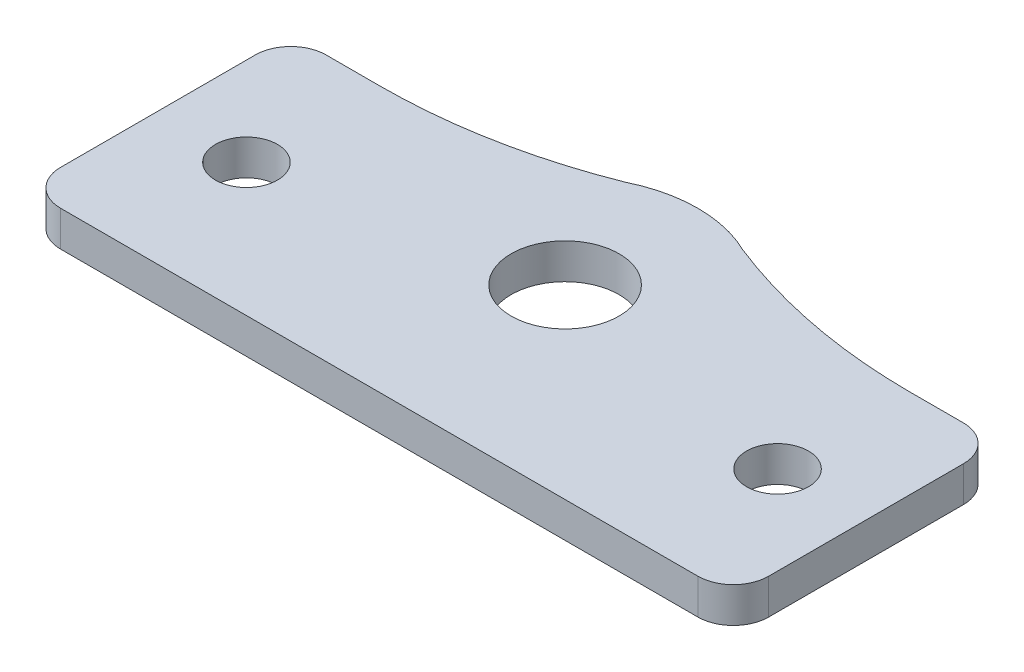
ISO-10303-21;
HEADER;
FILE_DESCRIPTION(('STEP AP214'),'2;1');
FILE_NAME('part.step','',(''),(''),'','','');
FILE_SCHEMA(('AUTOMOTIVE_DESIGN { 1 0 10303 214 1 1 1 1 }'));
ENDSEC;
DATA;
#1=APPLICATION_CONTEXT('core data for automotive mechanical design processes');
#2=APPLICATION_PROTOCOL_DEFINITION('international standard','automotive_design',2000,#1);
#3=PRODUCT_CONTEXT('',#1,'mechanical');
#4=PRODUCT('Part','Part','',(#3));
#5=PRODUCT_RELATED_PRODUCT_CATEGORY('part','',(#4));
#6=PRODUCT_DEFINITION_FORMATION('','',#4);
#7=PRODUCT_DEFINITION_CONTEXT('part definition',#1,'design');
#8=PRODUCT_DEFINITION('design','',#6,#7);
#9=PRODUCT_DEFINITION_SHAPE('','',#8);
#10=(LENGTH_UNIT() NAMED_UNIT(*) SI_UNIT(.MILLI.,.METRE.));
#11=(NAMED_UNIT(*) PLANE_ANGLE_UNIT() SI_UNIT($,.RADIAN.));
#12=(NAMED_UNIT(*) SI_UNIT($,.STERADIAN.) SOLID_ANGLE_UNIT());
#13=UNCERTAINTY_MEASURE_WITH_UNIT(LENGTH_MEASURE(1.E-05),#10,'distance_accuracy_value','');
#14=(GEOMETRIC_REPRESENTATION_CONTEXT(3) GLOBAL_UNCERTAINTY_ASSIGNED_CONTEXT((#13)) GLOBAL_UNIT_ASSIGNED_CONTEXT((#10,
#11,#12)) REPRESENTATION_CONTEXT('',''));
#15=CARTESIAN_POINT('',(0.,0.,0.));
#16=DIRECTION('',(0.,0.,1.));
#17=DIRECTION('',(1.,0.,0.));
#18=AXIS2_PLACEMENT_3D('',#15,#16,#17);
#19=CARTESIAN_POINT('',(30.,2.,-46.740697547539));
#20=DIRECTION('',(0.,-1.,0.));
#21=DIRECTION('',(0.,0.,-1.));
#22=AXIS2_PLACEMENT_3D('',#19,#20,#21);
#23=CYLINDRICAL_SURFACE('',#22,31.7406975475389);
#24=CARTESIAN_POINT('',(30.,0.,-46.740697547539));
#25=DIRECTION('',(0.,1.,0.));
#26=DIRECTION('',(0.,0.,1.));
#27=AXIS2_PLACEMENT_3D('',#24,#25,#26);
#28=CIRCLE('',#27,31.7406975475389);
#29=CARTESIAN_POINT('',(30.0000000000002,0.,-15.0000000000002));
#30=VERTEX_POINT('',#29);
#31=CARTESIAN_POINT('',(18.2990390831886,0.,-17.2354540401962));
#32=VERTEX_POINT('',#31);
#33=EDGE_CURVE('E185',#30,#32,#28,.F.);
#34=ORIENTED_EDGE('',*,*,#33,.T.);
#35=DIRECTION('',(0.,-1.,0.));
#36=VECTOR('',#35,1.);
#37=CARTESIAN_POINT('',(18.2990390831886,2.,-17.2354540401962));
#38=LINE('',#37,#36);
#39=CARTESIAN_POINT('',(18.2990390831886,2.,-17.2354540401962));
#40=VERTEX_POINT('',#39);
#41=EDGE_CURVE('E11',#40,#32,#38,.T.);
#42=ORIENTED_EDGE('',*,*,#41,.F.);
#43=CARTESIAN_POINT('',(30.,2.,-46.740697547539));
#44=DIRECTION('',(0.,1.,0.));
#45=DIRECTION('',(0.,0.,1.));
#46=AXIS2_PLACEMENT_3D('',#43,#44,#45);
#47=CIRCLE('',#46,31.7406975475389);
#48=CARTESIAN_POINT('',(30.0000000000002,2.,-15.0000000000002));
#49=VERTEX_POINT('',#48);
#50=EDGE_CURVE('E279',#49,#40,#47,.F.);
#51=ORIENTED_EDGE('',*,*,#50,.F.);
#52=DIRECTION('',(0.,-1.,0.));
#53=VECTOR('',#52,1.);
#54=CARTESIAN_POINT('',(30.0000000000002,2.,-15.0000000000002));
#55=LINE('',#54,#53);
#56=EDGE_CURVE('E172',#49,#30,#55,.T.);
#57=ORIENTED_EDGE('',*,*,#56,.T.);
#58=EDGE_LOOP('',(#34,#42,#51,#57));
#59=FACE_BOUND('',#58,.T.);
#60=ADVANCED_FACE('F45',(#59),#23,.F.);
#61=CARTESIAN_POINT('',(15.0000000000001,2.,-10.5000000000001));
#62=DIRECTION('',(0.,-1.,0.));
#63=DIRECTION('',(0.,0.,-1.));
#64=AXIS2_PLACEMENT_3D('',#61,#62,#63);
#65=CYLINDRICAL_SURFACE('',#64,7.49999999999986);
#66=CARTESIAN_POINT('',(15.0000000000001,0.,-10.5000000000001));
#67=DIRECTION('',(0.,1.,0.));
#68=DIRECTION('',(0.,0.,1.));
#69=AXIS2_PLACEMENT_3D('',#66,#67,#68);
#70=CIRCLE('',#69,7.49999999999986);
#71=CARTESIAN_POINT('',(11.7009609168114,0.,-17.2354540401961));
#72=VERTEX_POINT('',#71);
#73=EDGE_CURVE('E189',#32,#72,#70,.T.);
#74=ORIENTED_EDGE('',*,*,#73,.T.);
#75=DIRECTION('',(0.,-1.,0.));
#76=VECTOR('',#75,1.);
#77=CARTESIAN_POINT('',(11.7009609168114,2.,-17.2354540401961));
#78=LINE('',#77,#76);
#79=CARTESIAN_POINT('',(11.7009609168114,2.,-17.2354540401961));
#80=VERTEX_POINT('',#79);
#81=EDGE_CURVE('E55',#80,#72,#78,.T.);
#82=ORIENTED_EDGE('',*,*,#81,.F.);
#83=CARTESIAN_POINT('',(15.0000000000001,2.,-10.5000000000001));
#84=DIRECTION('',(0.,1.,0.));
#85=DIRECTION('',(0.,0.,1.));
#86=AXIS2_PLACEMENT_3D('',#83,#84,#85);
#87=CIRCLE('',#86,7.49999999999986);
#88=EDGE_CURVE('E117',#40,#80,#87,.T.);
#89=ORIENTED_EDGE('',*,*,#88,.F.);
#90=ORIENTED_EDGE('',*,*,#41,.T.);
#91=EDGE_LOOP('',(#74,#82,#89,#90));
#92=FACE_BOUND('',#91,.T.);
#93=ADVANCED_FACE('F258',(#92),#65,.T.);
#94=CARTESIAN_POINT('',(0.,2.,-46.740697547539));
#95=DIRECTION('',(0.,-1.,0.));
#96=DIRECTION('',(0.,0.,-1.));
#97=AXIS2_PLACEMENT_3D('',#94,#95,#96);
#98=CYLINDRICAL_SURFACE('',#97,31.740697547539);
#99=CARTESIAN_POINT('',(0.,0.,-46.740697547539));
#100=DIRECTION('',(0.,1.,0.));
#101=DIRECTION('',(0.,0.,1.));
#102=AXIS2_PLACEMENT_3D('',#99,#100,#101);
#103=CIRCLE('',#102,31.740697547539);
#104=CARTESIAN_POINT('',(0.,0.,-15.));
#105=VERTEX_POINT('',#104);
#106=EDGE_CURVE('E193',#105,#72,#103,.T.);
#107=ORIENTED_EDGE('',*,*,#106,.F.);
#108=DIRECTION('',(0.,-1.,0.));
#109=VECTOR('',#108,1.);
#110=CARTESIAN_POINT('',(0.,2.,-15.));
#111=LINE('',#110,#109);
#112=CARTESIAN_POINT('',(0.,2.,-15.));
#113=VERTEX_POINT('',#112);
#114=EDGE_CURVE('E249',#113,#105,#111,.T.);
#115=ORIENTED_EDGE('',*,*,#114,.F.);
#116=CARTESIAN_POINT('',(0.,2.,-46.740697547539));
#117=DIRECTION('',(0.,1.,0.));
#118=DIRECTION('',(0.,0.,1.));
#119=AXIS2_PLACEMENT_3D('',#116,#117,#118);
#120=CIRCLE('',#119,31.740697547539);
#121=EDGE_CURVE('E257',#113,#80,#120,.T.);
#122=ORIENTED_EDGE('',*,*,#121,.T.);
#123=ORIENTED_EDGE('',*,*,#81,.T.);
#124=EDGE_LOOP('',(#107,#115,#122,#123));
#125=FACE_BOUND('',#124,.T.);
#126=ADVANCED_FACE('F255',(#125),#98,.F.);
#127=CARTESIAN_POINT('',(0.,2.,-15.));
#128=DIRECTION('',(0.,0.,1.));
#129=DIRECTION('',(1.,0.,0.));
#130=AXIS2_PLACEMENT_3D('',#127,#128,#129);
#131=PLANE('',#130);
#132=DIRECTION('',(-1.,0.,0.));
#133=VECTOR('',#132,1.);
#134=CARTESIAN_POINT('',(0.,0.,-15.));
#135=LINE('',#134,#133);
#136=CARTESIAN_POINT('',(-3.,0.,-15.));
#137=VERTEX_POINT('',#136);
#138=EDGE_CURVE('E197',#105,#137,#135,.T.);
#139=ORIENTED_EDGE('',*,*,#138,.T.);
#140=DIRECTION('',(0.,-1.,0.));
#141=VECTOR('',#140,1.);
#142=CARTESIAN_POINT('',(-3.,2.,-15.));
#143=LINE('',#142,#141);
#144=CARTESIAN_POINT('',(-3.,2.,-15.));
#145=VERTEX_POINT('',#144);
#146=EDGE_CURVE('E246',#145,#137,#143,.T.);
#147=ORIENTED_EDGE('',*,*,#146,.F.);
#148=DIRECTION('',(-1.,0.,0.));
#149=VECTOR('',#148,1.);
#150=CARTESIAN_POINT('',(0.,2.,-15.));
#151=LINE('',#150,#149);
#152=EDGE_CURVE('E271',#113,#145,#151,.T.);
#153=ORIENTED_EDGE('',*,*,#152,.F.);
#154=ORIENTED_EDGE('',*,*,#114,.T.);
#155=EDGE_LOOP('',(#139,#147,#153,#154));
#156=FACE_BOUND('',#155,.T.);
#157=ADVANCED_FACE('F268',(#156),#131,.F.);
#158=CARTESIAN_POINT('',(-3.,2.,-13.));
#159=DIRECTION('',(0.,-1.,0.));
#160=DIRECTION('',(0.,0.,-1.));
#161=AXIS2_PLACEMENT_3D('',#158,#159,#160);
#162=CYLINDRICAL_SURFACE('',#161,2.);
#163=CARTESIAN_POINT('',(-3.,0.,-13.));
#164=DIRECTION('',(0.,1.,0.));
#165=DIRECTION('',(0.,0.,1.));
#166=AXIS2_PLACEMENT_3D('',#163,#164,#165);
#167=CIRCLE('',#166,2.);
#168=CARTESIAN_POINT('',(-5.,0.,-13.));
#169=VERTEX_POINT('',#168);
#170=EDGE_CURVE('E201',#169,#137,#167,.F.);
#171=ORIENTED_EDGE('',*,*,#170,.F.);
#172=DIRECTION('',(0.,-1.,0.));
#173=VECTOR('',#172,1.);
#174=CARTESIAN_POINT('',(-5.,2.,-13.));
#175=LINE('',#174,#173);
#176=CARTESIAN_POINT('',(-5.,2.,-13.));
#177=VERTEX_POINT('',#176);
#178=EDGE_CURVE('E243',#177,#169,#175,.T.);
#179=ORIENTED_EDGE('',*,*,#178,.F.);
#180=CARTESIAN_POINT('',(-3.,2.,-13.));
#181=DIRECTION('',(0.,1.,0.));
#182=DIRECTION('',(0.,0.,1.));
#183=AXIS2_PLACEMENT_3D('',#180,#181,#182);
#184=CIRCLE('',#183,2.);
#185=EDGE_CURVE('E274',#177,#145,#184,.F.);
#186=ORIENTED_EDGE('',*,*,#185,.T.);
#187=ORIENTED_EDGE('',*,*,#146,.T.);
#188=EDGE_LOOP('',(#171,#179,#186,#187));
#189=FACE_BOUND('',#188,.T.);
#190=ADVANCED_FACE('F434',(#189),#162,.T.);
#191=CARTESIAN_POINT('',(-5.,2.,0.));
#192=DIRECTION('',(1.,0.,0.));
#193=DIRECTION('',(0.,0.,-1.));
#194=AXIS2_PLACEMENT_3D('',#191,#192,#193);
#195=PLANE('',#194);
#196=DIRECTION('',(0.,0.,1.));
#197=VECTOR('',#196,1.);
#198=CARTESIAN_POINT('',(-5.,0.,0.));
#199=LINE('',#198,#197);
#200=CARTESIAN_POINT('',(-5.,0.,-2.));
#201=VERTEX_POINT('',#200);
#202=EDGE_CURVE('E205',#169,#201,#199,.T.);
#203=ORIENTED_EDGE('',*,*,#202,.T.);
#204=DIRECTION('',(0.,-1.,0.));
#205=VECTOR('',#204,1.);
#206=CARTESIAN_POINT('',(-5.,2.,-2.));
#207=LINE('',#206,#205);
#208=CARTESIAN_POINT('',(-5.,2.,-2.));
#209=VERTEX_POINT('',#208);
#210=EDGE_CURVE('E240',#209,#201,#207,.T.);
#211=ORIENTED_EDGE('',*,*,#210,.F.);
#212=DIRECTION('',(0.,0.,1.));
#213=VECTOR('',#212,1.);
#214=CARTESIAN_POINT('',(-5.,2.,0.));
#215=LINE('',#214,#213);
#216=EDGE_CURVE('E285',#177,#209,#215,.T.);
#217=ORIENTED_EDGE('',*,*,#216,.F.);
#218=ORIENTED_EDGE('',*,*,#178,.T.);
#219=EDGE_LOOP('',(#203,#211,#217,#218));
#220=FACE_BOUND('',#219,.T.);
#221=ADVANCED_FACE('F422',(#220),#195,.F.);
#222=CARTESIAN_POINT('',(-3.,2.,-2.));
#223=DIRECTION('',(0.,-1.,0.));
#224=DIRECTION('',(0.,0.,-1.));
#225=AXIS2_PLACEMENT_3D('',#222,#223,#224);
#226=CYLINDRICAL_SURFACE('',#225,2.);
#227=CARTESIAN_POINT('',(-3.,0.,-2.));
#228=DIRECTION('',(0.,1.,0.));
#229=DIRECTION('',(0.,0.,1.));
#230=AXIS2_PLACEMENT_3D('',#227,#228,#229);
#231=CIRCLE('',#230,2.);
#232=CARTESIAN_POINT('',(-3.,0.,0.));
#233=VERTEX_POINT('',#232);
#234=EDGE_CURVE('E209',#233,#201,#231,.F.);
#235=ORIENTED_EDGE('',*,*,#234,.F.);
#236=DIRECTION('',(0.,-1.,0.));
#237=VECTOR('',#236,1.);
#238=CARTESIAN_POINT('',(-3.,2.,0.));
#239=LINE('',#238,#237);
#240=CARTESIAN_POINT('',(-3.,2.,0.));
#241=VERTEX_POINT('',#240);
#242=EDGE_CURVE('E237',#241,#233,#239,.T.);
#243=ORIENTED_EDGE('',*,*,#242,.F.);
#244=CARTESIAN_POINT('',(-3.,2.,-2.));
#245=DIRECTION('',(0.,1.,0.));
#246=DIRECTION('',(0.,0.,1.));
#247=AXIS2_PLACEMENT_3D('',#244,#245,#246);
#248=CIRCLE('',#247,2.);
#249=EDGE_CURVE('E288',#241,#209,#248,.F.);
#250=ORIENTED_EDGE('',*,*,#249,.T.);
#251=ORIENTED_EDGE('',*,*,#210,.T.);
#252=EDGE_LOOP('',(#235,#243,#250,#251));
#253=FACE_BOUND('',#252,.T.);
#254=ADVANCED_FACE('F412',(#253),#226,.T.);
#255=CARTESIAN_POINT('',(0.,2.,0.));
#256=DIRECTION('',(0.,0.,-1.));
#257=DIRECTION('',(-1.,0.,0.));
#258=AXIS2_PLACEMENT_3D('',#255,#256,#257);
#259=PLANE('',#258);
#260=DIRECTION('',(1.,0.,0.));
#261=VECTOR('',#260,1.);
#262=CARTESIAN_POINT('',(0.,0.,0.));
#263=LINE('',#262,#261);
#264=CARTESIAN_POINT('',(33.0000000000002,0.,0.));
#265=VERTEX_POINT('',#264);
#266=EDGE_CURVE('E213',#233,#265,#263,.T.);
#267=ORIENTED_EDGE('',*,*,#266,.T.);
#268=DIRECTION('',(0.,-1.,0.));
#269=VECTOR('',#268,1.);
#270=CARTESIAN_POINT('',(33.0000000000002,2.,0.));
#271=LINE('',#270,#269);
#272=CARTESIAN_POINT('',(33.0000000000002,2.,0.));
#273=VERTEX_POINT('',#272);
#274=EDGE_CURVE('E233',#273,#265,#271,.T.);
#275=ORIENTED_EDGE('',*,*,#274,.F.);
#276=DIRECTION('',(1.,0.,0.));
#277=VECTOR('',#276,1.);
#278=CARTESIAN_POINT('',(0.,2.,0.));
#279=LINE('',#278,#277);
#280=EDGE_CURVE('E166',#241,#273,#279,.T.);
#281=ORIENTED_EDGE('',*,*,#280,.F.);
#282=ORIENTED_EDGE('',*,*,#242,.T.);
#283=EDGE_LOOP('',(#267,#275,#281,#282));
#284=FACE_BOUND('',#283,.T.);
#285=ADVANCED_FACE('F296',(#284),#259,.F.);
#286=CARTESIAN_POINT('',(33.0000000000002,2.,-2.));
#287=DIRECTION('',(0.,-1.,0.));
#288=DIRECTION('',(0.,0.,-1.));
#289=AXIS2_PLACEMENT_3D('',#286,#287,#288);
#290=CYLINDRICAL_SURFACE('',#289,2.);
#291=CARTESIAN_POINT('',(33.0000000000002,0.,-2.));
#292=DIRECTION('',(0.,1.,0.));
#293=DIRECTION('',(0.,0.,1.));
#294=AXIS2_PLACEMENT_3D('',#291,#292,#293);
#295=CIRCLE('',#294,2.);
#296=CARTESIAN_POINT('',(35.0000000000002,0.,-2.));
#297=VERTEX_POINT('',#296);
#298=EDGE_CURVE('E216',#265,#297,#295,.T.);
#299=ORIENTED_EDGE('',*,*,#298,.T.);
#300=DIRECTION('',(0.,-1.,0.));
#301=VECTOR('',#300,1.);
#302=CARTESIAN_POINT('',(35.0000000000002,2.,-2.));
#303=LINE('',#302,#301);
#304=CARTESIAN_POINT('',(35.0000000000002,2.,-2.));
#305=VERTEX_POINT('',#304);
#306=EDGE_CURVE('E152',#305,#297,#303,.T.);
#307=ORIENTED_EDGE('',*,*,#306,.F.);
#308=CARTESIAN_POINT('',(33.0000000000002,2.,-2.));
#309=DIRECTION('',(0.,1.,0.));
#310=DIRECTION('',(0.,0.,1.));
#311=AXIS2_PLACEMENT_3D('',#308,#309,#310);
#312=CIRCLE('',#311,2.);
#313=EDGE_CURVE('E161',#273,#305,#312,.T.);
#314=ORIENTED_EDGE('',*,*,#313,.F.);
#315=ORIENTED_EDGE('',*,*,#274,.T.);
#316=EDGE_LOOP('',(#299,#307,#314,#315));
#317=FACE_BOUND('',#316,.T.);
#318=ADVANCED_FACE('F300',(#317),#290,.T.);
#319=CARTESIAN_POINT('',(35.0000000000002,2.,0.));
#320=DIRECTION('',(1.,0.,0.));
#321=DIRECTION('',(0.,0.,-1.));
#322=AXIS2_PLACEMENT_3D('',#319,#320,#321);
#323=PLANE('',#322);
#324=DIRECTION('',(0.,0.,1.));
#325=VECTOR('',#324,1.);
#326=CARTESIAN_POINT('',(35.0000000000002,0.,0.));
#327=LINE('',#326,#325);
#328=CARTESIAN_POINT('',(35.0000000000002,0.,-13.));
#329=VERTEX_POINT('',#328);
#330=EDGE_CURVE('E150',#329,#297,#327,.T.);
#331=ORIENTED_EDGE('',*,*,#330,.F.);
#332=DIRECTION('',(0.,-1.,0.));
#333=VECTOR('',#332,1.);
#334=CARTESIAN_POINT('',(35.0000000000002,2.,-13.));
#335=LINE('',#334,#333);
#336=CARTESIAN_POINT('',(35.0000000000002,2.,-13.));
#337=VERTEX_POINT('',#336);
#338=EDGE_CURVE('E144',#337,#329,#335,.T.);
#339=ORIENTED_EDGE('',*,*,#338,.F.);
#340=DIRECTION('',(0.,0.,1.));
#341=VECTOR('',#340,1.);
#342=CARTESIAN_POINT('',(35.0000000000002,2.,0.));
#343=LINE('',#342,#341);
#344=EDGE_CURVE('E148',#337,#305,#343,.T.);
#345=ORIENTED_EDGE('',*,*,#344,.T.);
#346=ORIENTED_EDGE('',*,*,#306,.T.);
#347=EDGE_LOOP('',(#331,#339,#345,#346));
#348=FACE_BOUND('',#347,.T.);
#349=ADVANCED_FACE('F146',(#348),#323,.T.);
#350=CARTESIAN_POINT('',(33.0000000000002,2.,-13.));
#351=DIRECTION('',(0.,-1.,0.));
#352=DIRECTION('',(0.,0.,-1.));
#353=AXIS2_PLACEMENT_3D('',#350,#351,#352);
#354=CYLINDRICAL_SURFACE('',#353,2.);
#355=CARTESIAN_POINT('',(33.0000000000002,0.,-13.));
#356=DIRECTION('',(0.,1.,0.));
#357=DIRECTION('',(0.,0.,1.));
#358=AXIS2_PLACEMENT_3D('',#355,#356,#357);
#359=CIRCLE('',#358,2.);
#360=CARTESIAN_POINT('',(33.0000000000002,0.,-15.));
#361=VERTEX_POINT('',#360);
#362=EDGE_CURVE('E103',#329,#361,#359,.T.);
#363=ORIENTED_EDGE('',*,*,#362,.T.);
#364=DIRECTION('',(0.,-1.,0.));
#365=VECTOR('',#364,1.);
#366=CARTESIAN_POINT('',(33.0000000000002,2.,-15.));
#367=LINE('',#366,#365);
#368=CARTESIAN_POINT('',(33.0000000000002,2.,-15.));
#369=VERTEX_POINT('',#368);
#370=EDGE_CURVE('E153',#369,#361,#367,.T.);
#371=ORIENTED_EDGE('',*,*,#370,.F.);
#372=CARTESIAN_POINT('',(33.0000000000002,2.,-13.));
#373=DIRECTION('',(0.,1.,0.));
#374=DIRECTION('',(0.,0.,1.));
#375=AXIS2_PLACEMENT_3D('',#372,#373,#374);
#376=CIRCLE('',#375,2.);
#377=EDGE_CURVE('E155',#337,#369,#376,.T.);
#378=ORIENTED_EDGE('',*,*,#377,.F.);
#379=ORIENTED_EDGE('',*,*,#338,.T.);
#380=EDGE_LOOP('',(#363,#371,#378,#379));
#381=FACE_BOUND('',#380,.T.);
#382=ADVANCED_FACE('F156',(#381),#354,.T.);
#383=CARTESIAN_POINT('',(15.0000000000001,2.,-10.5000000000001));
#384=DIRECTION('',(0.,-1.,0.));
#385=DIRECTION('',(0.,0.,-1.));
#386=AXIS2_PLACEMENT_3D('',#383,#384,#385);
#387=CYLINDRICAL_SURFACE('',#386,3.05);
#388=CARTESIAN_POINT('',(15.0000000000001,2.,-10.5000000000001));
#389=DIRECTION('',(0.,1.,0.));
#390=DIRECTION('',(0.,0.,1.));
#391=AXIS2_PLACEMENT_3D('',#388,#389,#390);
#392=CIRCLE('',#391,3.05);
#393=CARTESIAN_POINT('',(15.0000000000001,2.,-7.45000000000015));
#394=VERTEX_POINT('',#393);
#395=EDGE_CURVE('E525',#394,#394,#392,.T.);
#396=ORIENTED_EDGE('',*,*,#395,.T.);
#397=EDGE_LOOP('',(#396));
#398=FACE_BOUND('',#397,.T.);
#399=CARTESIAN_POINT('',(15.0000000000001,0.,-10.5000000000001));
#400=DIRECTION('',(0.,1.,0.));
#401=DIRECTION('',(0.,0.,1.));
#402=AXIS2_PLACEMENT_3D('',#399,#400,#401);
#403=CIRCLE('',#402,3.05);
#404=CARTESIAN_POINT('',(15.0000000000001,0.,-7.45000000000015));
#405=VERTEX_POINT('',#404);
#406=EDGE_CURVE('E181',#405,#405,#403,.T.);
#407=ORIENTED_EDGE('',*,*,#406,.F.);
#408=EDGE_LOOP('',(#407));
#409=FACE_BOUND('',#408,.T.);
#410=ADVANCED_FACE('F324',(#398,#409),#387,.F.);
#411=CARTESIAN_POINT('',(30.0000000000002,2.,-7.5));
#412=DIRECTION('',(0.,-1.,0.));
#413=DIRECTION('',(0.,0.,-1.));
#414=AXIS2_PLACEMENT_3D('',#411,#412,#413);
#415=CYLINDRICAL_SURFACE('',#414,1.75);
#416=CARTESIAN_POINT('',(30.0000000000002,2.,-7.5));
#417=DIRECTION('',(0.,1.,0.));
#418=DIRECTION('',(0.,0.,1.));
#419=AXIS2_PLACEMENT_3D('',#416,#417,#418);
#420=CIRCLE('',#419,1.75);
#421=CARTESIAN_POINT('',(30.0000000000002,2.,-5.75));
#422=VERTEX_POINT('',#421);
#423=EDGE_CURVE('E334',#422,#422,#420,.F.);
#424=ORIENTED_EDGE('',*,*,#423,.F.);
#425=EDGE_LOOP('',(#424));
#426=FACE_BOUND('',#425,.T.);
#427=CARTESIAN_POINT('',(30.0000000000002,0.,-7.5));
#428=DIRECTION('',(0.,1.,0.));
#429=DIRECTION('',(0.,0.,1.));
#430=AXIS2_PLACEMENT_3D('',#427,#428,#429);
#431=CIRCLE('',#430,1.75);
#432=CARTESIAN_POINT('',(30.0000000000002,0.,-5.75));
#433=VERTEX_POINT('',#432);
#434=EDGE_CURVE('E177',#433,#433,#431,.F.);
#435=ORIENTED_EDGE('',*,*,#434,.T.);
#436=EDGE_LOOP('',(#435));
#437=FACE_BOUND('',#436,.T.);
#438=ADVANCED_FACE('F312',(#426,#437),#415,.F.);
#439=CARTESIAN_POINT('',(0.,2.,-7.5));
#440=DIRECTION('',(0.,-1.,0.));
#441=DIRECTION('',(0.,0.,-1.));
#442=AXIS2_PLACEMENT_3D('',#439,#440,#441);
#443=CYLINDRICAL_SURFACE('',#442,1.75);
#444=CARTESIAN_POINT('',(0.,2.,-7.5));
#445=DIRECTION('',(0.,1.,0.));
#446=DIRECTION('',(0.,0.,1.));
#447=AXIS2_PLACEMENT_3D('',#444,#445,#446);
#448=CIRCLE('',#447,1.75);
#449=CARTESIAN_POINT('',(0.,2.,-5.75));
#450=VERTEX_POINT('',#449);
#451=EDGE_CURVE('E226',#450,#450,#448,.T.);
#452=ORIENTED_EDGE('',*,*,#451,.T.);
#453=EDGE_LOOP('',(#452));
#454=FACE_BOUND('',#453,.T.);
#455=CARTESIAN_POINT('',(0.,0.,-7.5));
#456=DIRECTION('',(0.,1.,0.));
#457=DIRECTION('',(0.,0.,1.));
#458=AXIS2_PLACEMENT_3D('',#455,#456,#457);
#459=CIRCLE('',#458,1.75);
#460=CARTESIAN_POINT('',(0.,0.,-5.75));
#461=VERTEX_POINT('',#460);
#462=EDGE_CURVE('E173',#461,#461,#459,.T.);
#463=ORIENTED_EDGE('',*,*,#462,.F.);
#464=EDGE_LOOP('',(#463));
#465=FACE_BOUND('',#464,.T.);
#466=ADVANCED_FACE('F47',(#454,#465),#443,.F.);
#467=CARTESIAN_POINT('',(1.20563281580409E-12,2.,-15.0000000000027));
#468=DIRECTION('',(0.,0.,1.));
#469=DIRECTION('',(1.,0.,0.));
#470=AXIS2_PLACEMENT_3D('',#467,#468,#469);
#471=PLANE('',#470);
#472=DIRECTION('',(-1.,0.,0.));
#473=VECTOR('',#472,1.);
#474=CARTESIAN_POINT('',(1.20563281580409E-12,0.,-15.0000000000027));
#475=LINE('',#474,#473);
#476=EDGE_CURVE('E109',#361,#30,#475,.T.);
#477=ORIENTED_EDGE('',*,*,#476,.T.);
#478=ORIENTED_EDGE('',*,*,#56,.F.);
#479=DIRECTION('',(-1.,0.,0.));
#480=VECTOR('',#479,1.);
#481=CARTESIAN_POINT('',(1.20563281580409E-12,2.,-15.0000000000027));
#482=LINE('',#481,#480);
#483=EDGE_CURVE('E63',#369,#49,#482,.T.);
#484=ORIENTED_EDGE('',*,*,#483,.F.);
#485=ORIENTED_EDGE('',*,*,#370,.T.);
#486=EDGE_LOOP('',(#477,#478,#484,#485));
#487=FACE_BOUND('',#486,.T.);
#488=ADVANCED_FACE('F303',(#487),#471,.F.);
#489=CARTESIAN_POINT('',(0.,2.,0.));
#490=DIRECTION('',(0.,1.,0.));
#491=DIRECTION('',(0.,0.,1.));
#492=AXIS2_PLACEMENT_3D('',#489,#490,#491);
#493=PLANE('',#492);
#494=ORIENTED_EDGE('',*,*,#451,.F.);
#495=EDGE_LOOP('',(#494));
#496=FACE_BOUND('',#495,.T.);
#497=ORIENTED_EDGE('',*,*,#423,.T.);
#498=EDGE_LOOP('',(#497));
#499=FACE_BOUND('',#498,.T.);
#500=ORIENTED_EDGE('',*,*,#395,.F.);
#501=EDGE_LOOP('',(#500));
#502=FACE_BOUND('',#501,.T.);
#503=ORIENTED_EDGE('',*,*,#50,.T.);
#504=ORIENTED_EDGE('',*,*,#88,.T.);
#505=ORIENTED_EDGE('',*,*,#121,.F.);
#506=ORIENTED_EDGE('',*,*,#152,.T.);
#507=ORIENTED_EDGE('',*,*,#185,.F.);
#508=ORIENTED_EDGE('',*,*,#216,.T.);
#509=ORIENTED_EDGE('',*,*,#249,.F.);
#510=ORIENTED_EDGE('',*,*,#280,.T.);
#511=ORIENTED_EDGE('',*,*,#313,.T.);
#512=ORIENTED_EDGE('',*,*,#344,.F.);
#513=ORIENTED_EDGE('',*,*,#377,.T.);
#514=ORIENTED_EDGE('',*,*,#483,.T.);
#515=EDGE_LOOP('',(#503,#504,#505,#506,#507,#508,#509,#510,#511,#512,#513,#514));
#516=FACE_BOUND('',#515,.T.);
#517=ADVANCED_FACE('F159',(#496,#499,#502,#516),#493,.T.);
#518=CARTESIAN_POINT('',(0.,0.,0.));
#519=DIRECTION('',(0.,1.,0.));
#520=DIRECTION('',(0.,0.,1.));
#521=AXIS2_PLACEMENT_3D('',#518,#519,#520);
#522=PLANE('',#521);
#523=ORIENTED_EDGE('',*,*,#462,.T.);
#524=EDGE_LOOP('',(#523));
#525=FACE_BOUND('',#524,.T.);
#526=ORIENTED_EDGE('',*,*,#434,.F.);
#527=EDGE_LOOP('',(#526));
#528=FACE_BOUND('',#527,.T.);
#529=ORIENTED_EDGE('',*,*,#406,.T.);
#530=EDGE_LOOP('',(#529));
#531=FACE_BOUND('',#530,.T.);
#532=ORIENTED_EDGE('',*,*,#33,.F.);
#533=ORIENTED_EDGE('',*,*,#476,.F.);
#534=ORIENTED_EDGE('',*,*,#362,.F.);
#535=ORIENTED_EDGE('',*,*,#330,.T.);
#536=ORIENTED_EDGE('',*,*,#298,.F.);
#537=ORIENTED_EDGE('',*,*,#266,.F.);
#538=ORIENTED_EDGE('',*,*,#234,.T.);
#539=ORIENTED_EDGE('',*,*,#202,.F.);
#540=ORIENTED_EDGE('',*,*,#170,.T.);
#541=ORIENTED_EDGE('',*,*,#138,.F.);
#542=ORIENTED_EDGE('',*,*,#106,.T.);
#543=ORIENTED_EDGE('',*,*,#73,.F.);
#544=EDGE_LOOP('',(#532,#533,#534,#535,#536,#537,#538,#539,#540,#541,#542,#543));
#545=FACE_BOUND('',#544,.T.);
#546=ADVANCED_FACE('F263',(#525,#528,#531,#545),#522,.F.);
#547=CLOSED_SHELL('',(#60,#93,#126,#157,#190,#221,#254,#285,#318,#349,#382,#410,#438,#466,#488,
#517,#546));
#548=MANIFOLD_SOLID_BREP('B2',#547);
#549=ADVANCED_BREP_SHAPE_REPRESENTATION('',(#18,#548),#14);
#550=SHAPE_DEFINITION_REPRESENTATION(#9,#549);
ENDSEC;
END-ISO-10303-21;
